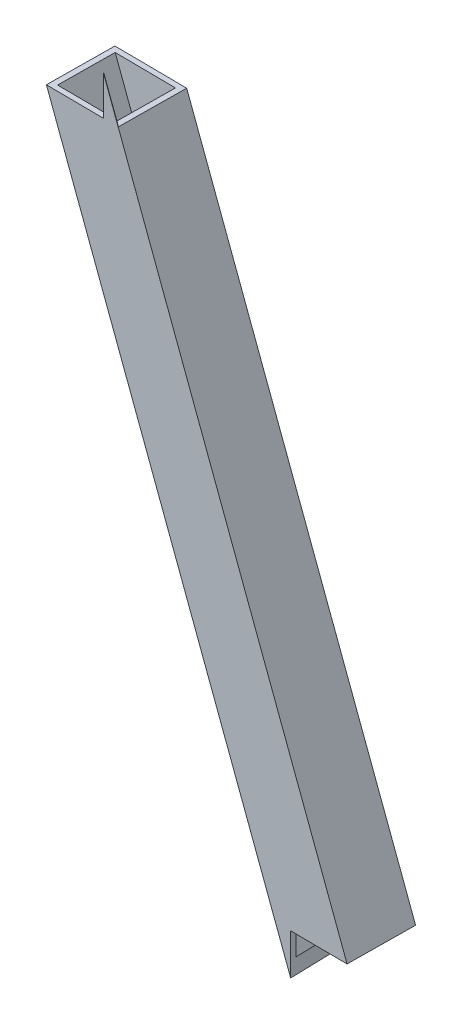
ISO-10303-21;
HEADER;
FILE_DESCRIPTION(('STEP AP214'),'2;1');
FILE_NAME('part.step','',(''),(''),'','','');
FILE_SCHEMA(('AUTOMOTIVE_DESIGN { 1 0 10303 214 1 1 1 1 }'));
ENDSEC;
DATA;
#1=APPLICATION_CONTEXT('core data for automotive mechanical design processes');
#2=APPLICATION_PROTOCOL_DEFINITION('international standard','automotive_design',2000,#1);
#3=PRODUCT_CONTEXT('',#1,'mechanical');
#4=PRODUCT('Part','Part','',(#3));
#5=PRODUCT_RELATED_PRODUCT_CATEGORY('part','',(#4));
#6=PRODUCT_DEFINITION_FORMATION('','',#4);
#7=PRODUCT_DEFINITION_CONTEXT('part definition',#1,'design');
#8=PRODUCT_DEFINITION('design','',#6,#7);
#9=PRODUCT_DEFINITION_SHAPE('','',#8);
#10=(LENGTH_UNIT() NAMED_UNIT(*) SI_UNIT(.MILLI.,.METRE.));
#11=(NAMED_UNIT(*) PLANE_ANGLE_UNIT() SI_UNIT($,.RADIAN.));
#12=(NAMED_UNIT(*) SI_UNIT($,.STERADIAN.) SOLID_ANGLE_UNIT());
#13=UNCERTAINTY_MEASURE_WITH_UNIT(LENGTH_MEASURE(1.E-05),#10,'distance_accuracy_value','');
#14=(GEOMETRIC_REPRESENTATION_CONTEXT(3) GLOBAL_UNCERTAINTY_ASSIGNED_CONTEXT((#13)) GLOBAL_UNIT_ASSIGNED_CONTEXT((#10,
#11,#12)) REPRESENTATION_CONTEXT('',''));
#15=CARTESIAN_POINT('',(0.,0.,0.));
#16=DIRECTION('',(0.,0.,1.));
#17=DIRECTION('',(1.,0.,0.));
#18=AXIS2_PLACEMENT_3D('',#15,#16,#17);
#19=CARTESIAN_POINT('',(-215.72801678848,203.47699370432,-189.903424238614));
#20=DIRECTION('',(0.00908676337012188,0.0034075362637957,-0.999952908605234));
#21=DIRECTION('',(-0.999958714034088,0.,-0.00908681612516445));
#22=AXIS2_PLACEMENT_3D('',#19,#20,#21);
#23=PLANE('',#22);
#24=DIRECTION('',(0.,-0.999994193852042,-0.00340767695139654));
#25=VECTOR('',#24,1.);
#26=CARTESIAN_POINT('',(-159.999999999999,203.475268028738,-189.397018969942));
#27=LINE('',#26,#25);
#28=CARTESIAN_POINT('',(-159.999999999999,10.,-190.056324009492));
#29=VERTEX_POINT('',#28);
#30=CARTESIAN_POINT('',(-159.999999999999,-2.08839370672417,-190.097517589282));
#31=VERTEX_POINT('',#30);
#32=EDGE_CURVE('E81',#29,#31,#27,.T.);
#33=ORIENTED_EDGE('',*,*,#32,.F.);
#34=DIRECTION('',(-0.999958714034088,0.,-0.00908681612516445));
#35=VECTOR('',#34,1.);
#36=CARTESIAN_POINT('',(-215.722025998725,10.,-190.56268071929));
#37=LINE('',#36,#35);
#38=CARTESIAN_POINT('',(-143.17414414936,10.,-189.903424238614));
#39=VERTEX_POINT('',#38);
#40=EDGE_CURVE('E215',#39,#29,#37,.T.);
#41=ORIENTED_EDGE('',*,*,#40,.F.);
#42=DIRECTION('',(0.351123441588392,-0.936329177569044,0.));
#43=VECTOR('',#42,1.);
#44=CARTESIAN_POINT('',(-215.72801678848,203.47699370432,-189.903424238614));
#45=LINE('',#44,#43);
#46=CARTESIAN_POINT('',(-215.,201.535615601707,-189.903424238614));
#47=VERTEX_POINT('',#46);
#48=EDGE_CURVE('E149',#47,#39,#45,.T.);
#49=ORIENTED_EDGE('',*,*,#48,.F.);
#50=DIRECTION('',(0.,0.999994193852042,0.00340767695139654));
#51=VECTOR('',#50,1.);
#52=CARTESIAN_POINT('',(-215.,203.476971160528,-189.896808687611));
#53=LINE('',#52,#51);
#54=CARTESIAN_POINT('',(-215.,190.,-189.942734118259));
#55=VERTEX_POINT('',#54);
#56=EDGE_CURVE('E95',#55,#47,#53,.T.);
#57=ORIENTED_EDGE('',*,*,#56,.F.);
#58=DIRECTION('',(0.999958714034088,0.,0.00908681612516445));
#59=VECTOR('',#58,1.);
#60=CARTESIAN_POINT('',(-215.727599489067,190.,-189.949345954005));
#61=LINE('',#60,#59);
#62=CARTESIAN_POINT('',(-232.033147640021,190.,-190.097517589282));
#63=VERTEX_POINT('',#62);
#64=EDGE_CURVE('E156',#63,#55,#61,.T.);
#65=ORIENTED_EDGE('',*,*,#64,.F.);
#66=DIRECTION('',(0.351123441588392,-0.936329177569044,0.));
#67=VECTOR('',#66,1.);
#68=CARTESIAN_POINT('',(-234.453718478922,196.454855570404,-190.097517589282));
#69=LINE('',#68,#67);
#70=EDGE_CURVE('E45',#63,#31,#69,.T.);
#71=ORIENTED_EDGE('',*,*,#70,.T.);
#72=EDGE_LOOP('',(#33,#41,#49,#57,#65,#71));
#73=FACE_BOUND('',#72,.T.);
#74=ADVANCED_FACE('F41',(#73),#23,.F.);
#75=CARTESIAN_POINT('',(-217.211534102323,202.920674711628,-191.518876360436));
#76=DIRECTION('',(0.00908676337012202,0.00340753626379576,-0.999952908605234));
#77=DIRECTION('',(-0.999958714034088,0.,-0.00908681612516459));
#78=AXIS2_PLACEMENT_3D('',#75,#76,#77);
#79=PLANE('',#78);
#80=DIRECTION('',(-0.999958714034088,0.,-0.00908681612516459));
#81=VECTOR('',#80,1.);
#82=CARTESIAN_POINT('',(-217.205560538338,10.,-192.176237231229));
#83=LINE('',#82,#81);
#84=CARTESIAN_POINT('',(-144.866281085462,10.,-191.518876360436));
#85=VERTEX_POINT('',#84);
#86=CARTESIAN_POINT('',(-160.000000000002,10.,-191.656399359272));
#87=VERTEX_POINT('',#86);
#88=EDGE_CURVE('E226',#85,#87,#83,.T.);
#89=ORIENTED_EDGE('',*,*,#88,.T.);
#90=DIRECTION('',(0.,-0.999994193852042,-0.00340767695139659));
#91=VECTOR('',#90,1.);
#92=CARTESIAN_POINT('',(-159.999999999999,202.918903097401,-190.998990242683));
#93=LINE('',#92,#91);
#94=CARTESIAN_POINT('',(-159.999999999999,2.51241595302107,-191.681914774997));
#95=VERTEX_POINT('',#94);
#96=EDGE_CURVE('E188',#87,#95,#93,.T.);
#97=ORIENTED_EDGE('',*,*,#96,.T.);
#98=DIRECTION('',(0.351123441588392,-0.936329177569044,0.));
#99=VECTOR('',#98,1.);
#100=CARTESIAN_POINT('',(-232.941123522295,197.022078679139,-191.681914774997));
#101=LINE('',#100,#99);
#102=CARTESIAN_POINT('',(-230.307844017617,190.,-191.681914774997));
#103=VERTEX_POINT('',#102);
#104=EDGE_CURVE('E169',#103,#95,#101,.T.);
#105=ORIENTED_EDGE('',*,*,#104,.F.);
#106=DIRECTION('',(0.999958714034088,0.,0.00908681612516459));
#107=VECTOR('',#106,1.);
#108=CARTESIAN_POINT('',(-217.21113402868,190.,-191.562902465944));
#109=LINE('',#108,#107);
#110=CARTESIAN_POINT('',(-212.366281085463,190.,-191.518876360436));
#111=VERTEX_POINT('',#110);
#112=EDGE_CURVE('E182',#103,#111,#109,.T.);
#113=ORIENTED_EDGE('',*,*,#112,.T.);
#114=DIRECTION('',(0.351123441588392,-0.936329177569044,0.));
#115=VECTOR('',#114,1.);
#116=CARTESIAN_POINT('',(-217.211534102323,202.920674711628,-191.518876360436));
#117=LINE('',#116,#115);
#118=EDGE_CURVE('E175',#111,#85,#117,.T.);
#119=ORIENTED_EDGE('',*,*,#118,.T.);
#120=EDGE_LOOP('',(#89,#97,#105,#113,#119));
#121=FACE_BOUND('',#120,.T.);
#122=ADVANCED_FACE('F262',(#121),#79,.T.);
#123=CARTESIAN_POINT('',(-217.058876477705,202.97792132086,-208.318085225003));
#124=DIRECTION('',(-0.00908676337012202,-0.00340753626379576,0.999952908605234));
#125=DIRECTION('',(0.999958714034088,0.,0.00908681612516459));
#126=AXIS2_PLACEMENT_3D('',#123,#124,#125);
#127=PLANE('',#126);
#128=DIRECTION('',(0.351123441588392,-0.936329177569044,0.));
#129=VECTOR('',#128,1.);
#130=CARTESIAN_POINT('',(-232.788465897676,197.079325288371,-208.481123639564));
#131=LINE('',#130,#129);
#132=CARTESIAN_POINT('',(-230.133718914537,190.,-208.481123639564));
#133=VERTEX_POINT('',#132);
#134=CARTESIAN_POINT('',(-159.999999999999,2.97674956123141,-208.481123639564));
#135=VERTEX_POINT('',#134);
#136=EDGE_CURVE('E172',#133,#135,#131,.T.);
#137=ORIENTED_EDGE('',*,*,#136,.T.);
#138=DIRECTION('',(0.,0.999994193852042,0.00340767695139659));
#139=VECTOR('',#138,1.);
#140=CARTESIAN_POINT('',(-159.999999999999,202.976154433834,-207.799586320181));
#141=LINE('',#140,#139);
#142=CARTESIAN_POINT('',(-159.999999999999,10.,-208.457190531961));
#143=VERTEX_POINT('',#142);
#144=EDGE_CURVE('E174',#135,#143,#141,.T.);
#145=ORIENTED_EDGE('',*,*,#144,.T.);
#146=DIRECTION('',(0.999958714034088,0.,0.00908681612516459));
#147=VECTOR('',#146,1.);
#148=CARTESIAN_POINT('',(-217.052901141145,10.,-208.975641158773));
#149=LINE('',#148,#147);
#150=CARTESIAN_POINT('',(-144.692155982383,10.,-208.318085225003));
#151=VERTEX_POINT('',#150);
#152=EDGE_CURVE('E180',#143,#151,#149,.T.);
#153=ORIENTED_EDGE('',*,*,#152,.T.);
#154=DIRECTION('',(0.351123441588392,-0.936329177569044,0.));
#155=VECTOR('',#154,1.);
#156=CARTESIAN_POINT('',(-217.058876477705,202.97792132086,-208.318085225003));
#157=LINE('',#156,#155);
#158=CARTESIAN_POINT('',(-212.192155982383,190.,-208.318085225003));
#159=VERTEX_POINT('',#158);
#160=EDGE_CURVE('E192',#159,#151,#157,.T.);
#161=ORIENTED_EDGE('',*,*,#160,.F.);
#162=DIRECTION('',(-0.999958714034088,0.,-0.00908681612516459));
#163=VECTOR('',#162,1.);
#164=CARTESIAN_POINT('',(-217.058474631488,190.,-208.362306393488));
#165=LINE('',#164,#163);
#166=EDGE_CURVE('E210',#159,#133,#165,.T.);
#167=ORIENTED_EDGE('',*,*,#166,.T.);
#168=EDGE_LOOP('',(#137,#145,#153,#161,#167));
#169=FACE_BOUND('',#168,.T.);
#170=ADVANCED_FACE('F267',(#169),#127,.T.);
#171=CARTESIAN_POINT('',(-215.546281521078,203.545144429596,-209.902482410718));
#172=DIRECTION('',(-0.0090867633701231,-0.00340753626379616,0.999952908605233));
#173=DIRECTION('',(0.999958714034088,0.,0.00908681612516567));
#174=AXIS2_PLACEMENT_3D('',#171,#172,#173);
#175=PLANE('',#174);
#176=DIRECTION('',(0.,0.999994193852042,0.003407676951397));
#177=VECTOR('',#176,1.);
#178=CARTESIAN_POINT('',(-159.999999999999,203.543424381634,-209.39772858601));
#179=LINE('',#178,#177);
#180=CARTESIAN_POINT('',(-159.999999999999,-1.53561560170892,-210.096575761386));
#181=VERTEX_POINT('',#180);
#182=CARTESIAN_POINT('',(-159.999999999999,10.,-210.057265881741));
#183=VERTEX_POINT('',#182);
#184=EDGE_CURVE('E11',#181,#183,#179,.T.);
#185=ORIENTED_EDGE('',*,*,#184,.F.);
#186=DIRECTION('',(0.351123441588392,-0.936329177569044,0.));
#187=VECTOR('',#186,1.);
#188=CARTESIAN_POINT('',(-234.27198321152,196.52300629568,-210.096575761386));
#189=LINE('',#188,#187);
#190=CARTESIAN_POINT('',(-231.82585585064,190.,-210.096575761386));
#191=VERTEX_POINT('',#190);
#192=EDGE_CURVE('E154',#191,#181,#189,.T.);
#193=ORIENTED_EDGE('',*,*,#192,.F.);
#194=DIRECTION('',(-0.999958714034088,0.,-0.00908681612516567));
#195=VECTOR('',#194,1.);
#196=CARTESIAN_POINT('',(-215.545862111457,190.,-209.948636343938));
#197=LINE('',#196,#195);
#198=CARTESIAN_POINT('',(-210.466852359978,190.,-209.902482410718));
#199=VERTEX_POINT('',#198);
#200=EDGE_CURVE('E137',#199,#191,#197,.T.);
#201=ORIENTED_EDGE('',*,*,#200,.F.);
#202=DIRECTION('',(0.351123441588392,-0.936329177569044,0.));
#203=VECTOR('',#202,1.);
#204=CARTESIAN_POINT('',(-215.546281521078,203.545144429596,-209.902482410718));
#205=LINE('',#204,#203);
#206=CARTESIAN_POINT('',(-142.966852359979,10.,-209.902482410718));
#207=VERTEX_POINT('',#206);
#208=EDGE_CURVE('E171',#199,#207,#205,.T.);
#209=ORIENTED_EDGE('',*,*,#208,.T.);
#210=DIRECTION('',(0.999958714034088,0.,0.00908681612516567));
#211=VECTOR('',#210,1.);
#212=CARTESIAN_POINT('',(-215.540288621115,10.,-210.561971109223));
#213=LINE('',#212,#211);
#214=EDGE_CURVE('E218',#183,#207,#213,.T.);
#215=ORIENTED_EDGE('',*,*,#214,.F.);
#216=EDGE_LOOP('',(#185,#193,#201,#209,#215));
#217=FACE_BOUND('',#216,.T.);
#218=ADVANCED_FACE('F158',(#217),#175,.F.);
#219=CARTESIAN_POINT('',(-232.941123522295,197.022078679139,-191.681914774997));
#220=DIRECTION('',(0.936285084522112,0.351106906695792,0.00970466753340175));
#221=DIRECTION('',(-0.351123441588392,0.936329177569045,0.));
#222=AXIS2_PLACEMENT_3D('',#219,#220,#221);
#223=PLANE('',#222);
#224=ORIENTED_EDGE('',*,*,#104,.T.);
#225=DIRECTION('',(0.,0.0276296546156806,-0.999618228218062));
#226=VECTOR('',#225,1.);
#227=CARTESIAN_POINT('',(-159.999999999999,2.66090420438006,-197.054097844335));
#228=LINE('',#227,#226);
#229=EDGE_CURVE('E164',#95,#135,#228,.T.);
#230=ORIENTED_EDGE('',*,*,#229,.T.);
#231=ORIENTED_EDGE('',*,*,#136,.F.);
#232=DIRECTION('',(-0.0103645208346853,0.,0.999946286911386));
#233=VECTOR('',#232,1.);
#234=CARTESIAN_POINT('',(-230.308126893171,190.,-191.654623560681));
#235=LINE('',#234,#233);
#236=EDGE_CURVE('E160',#133,#103,#235,.T.);
#237=ORIENTED_EDGE('',*,*,#236,.T.);
#238=EDGE_LOOP('',(#224,#230,#231,#237));
#239=FACE_BOUND('',#238,.T.);
#240=ADVANCED_FACE('F257',(#239),#223,.T.);
#241=CARTESIAN_POINT('',(-234.453718478922,196.454855570404,-190.097517589282));
#242=DIRECTION('',(0.936285084522112,0.351106906695792,0.00970466753338271));
#243=DIRECTION('',(-0.351123441588392,0.936329177569045,0.));
#244=AXIS2_PLACEMENT_3D('',#241,#242,#243);
#245=PLANE('',#244);
#246=DIRECTION('',(0.,0.0276296546156264,-0.999618228218064));
#247=VECTOR('',#246,1.);
#248=CARTESIAN_POINT('',(-159.999999999999,-1.93682622420605,-195.581104714708));
#249=LINE('',#248,#247);
#250=EDGE_CURVE('E51',#31,#181,#249,.T.);
#251=ORIENTED_EDGE('',*,*,#250,.F.);
#252=ORIENTED_EDGE('',*,*,#70,.F.);
#253=DIRECTION('',(-0.010364520834665,0.,0.999946286911386));
#254=VECTOR('',#253,1.);
#255=CARTESIAN_POINT('',(-232.033407665709,190.,-190.072430879947));
#256=LINE('',#255,#254);
#257=EDGE_CURVE('E141',#191,#63,#256,.T.);
#258=ORIENTED_EDGE('',*,*,#257,.F.);
#259=ORIENTED_EDGE('',*,*,#192,.T.);
#260=EDGE_LOOP('',(#251,#252,#258,#259));
#261=FACE_BOUND('',#260,.T.);
#262=ADVANCED_FACE('F153',(#261),#245,.F.);
#263=CARTESIAN_POINT('',(-215.72801678848,203.47699370432,-189.903424238614));
#264=DIRECTION('',(-0.936285084522112,-0.351106906695792,-0.00970466753338269));
#265=DIRECTION('',(0.351123441588392,-0.936329177569045,0.));
#266=AXIS2_PLACEMENT_3D('',#263,#264,#265);
#267=PLANE('',#266);
#268=DIRECTION('',(0.,0.0276296546156255,-0.999618228218064));
#269=VECTOR('',#268,1.);
#270=CARTESIAN_POINT('',(-215.,201.537097645507,-189.957043366979));
#271=LINE('',#270,#269);
#272=CARTESIAN_POINT('',(-215.,201.53828497573,-190.));
#273=VERTEX_POINT('',#272);
#274=EDGE_CURVE('E89',#47,#273,#271,.T.);
#275=ORIENTED_EDGE('',*,*,#274,.F.);
#276=ORIENTED_EDGE('',*,*,#48,.T.);
#277=DIRECTION('',(-0.010364520834665,0.,0.999946286911386));
#278=VECTOR('',#277,1.);
#279=CARTESIAN_POINT('',(-143.181938125216,10.,-189.151478505507));
#280=LINE('',#279,#278);
#281=EDGE_CURVE('E204',#207,#39,#280,.T.);
#282=ORIENTED_EDGE('',*,*,#281,.F.);
#283=ORIENTED_EDGE('',*,*,#208,.F.);
#284=DIRECTION('',(0.010364520834665,0.,-0.999946286911386));
#285=VECTOR('',#284,1.);
#286=CARTESIAN_POINT('',(-210.674687052997,190.,-189.851046083893));
#287=LINE('',#286,#285);
#288=CARTESIAN_POINT('',(-210.673143134101,190.,-190.));
#289=VERTEX_POINT('',#288);
#290=EDGE_CURVE('E145',#289,#199,#287,.T.);
#291=ORIENTED_EDGE('',*,*,#290,.F.);
#292=DIRECTION('',(0.351123441588392,-0.936329177569045,0.));
#293=VECTOR('',#292,1.);
#294=CARTESIAN_POINT('',(-215.727139186061,203.477322805227,-190.));
#295=LINE('',#294,#293);
#296=EDGE_CURVE('E199',#273,#289,#295,.T.);
#297=ORIENTED_EDGE('',*,*,#296,.F.);
#298=EDGE_LOOP('',(#275,#276,#282,#283,#291,#297));
#299=FACE_BOUND('',#298,.T.);
#300=ADVANCED_FACE('F247',(#299),#267,.F.);
#301=CARTESIAN_POINT('',(-235.,190.,-450.));
#302=DIRECTION('',(0.,1.,0.));
#303=DIRECTION('',(0.,0.,1.));
#304=AXIS2_PLACEMENT_3D('',#301,#302,#303);
#305=PLANE('',#304);
#306=ORIENTED_EDGE('',*,*,#236,.F.);
#307=ORIENTED_EDGE('',*,*,#166,.F.);
#308=DIRECTION('',(0.0103645208346853,0.,-0.999946286911386));
#309=VECTOR('',#308,1.);
#310=CARTESIAN_POINT('',(-212.366801578493,190.,-191.468660331996));
#311=LINE('',#310,#309);
#312=EDGE_CURVE('E195',#111,#159,#311,.T.);
#313=ORIENTED_EDGE('',*,*,#312,.F.);
#314=ORIENTED_EDGE('',*,*,#112,.F.);
#315=EDGE_LOOP('',(#306,#307,#313,#314));
#316=FACE_BOUND('',#315,.T.);
#317=ORIENTED_EDGE('',*,*,#200,.T.);
#318=ORIENTED_EDGE('',*,*,#257,.T.);
#319=ORIENTED_EDGE('',*,*,#64,.T.);
#320=DIRECTION('',(0.,0.,1.));
#321=VECTOR('',#320,1.);
#322=CARTESIAN_POINT('',(-215.,190.,-450.));
#323=LINE('',#322,#321);
#324=CARTESIAN_POINT('',(-215.,190.,-190.));
#325=VERTEX_POINT('',#324);
#326=EDGE_CURVE('E201',#325,#55,#323,.T.);
#327=ORIENTED_EDGE('',*,*,#326,.F.);
#328=DIRECTION('',(1.,0.,0.));
#329=VECTOR('',#328,1.);
#330=CARTESIAN_POINT('',(-225.,190.,-190.));
#331=LINE('',#330,#329);
#332=EDGE_CURVE('E205',#325,#289,#331,.T.);
#333=ORIENTED_EDGE('',*,*,#332,.T.);
#334=ORIENTED_EDGE('',*,*,#290,.T.);
#335=EDGE_LOOP('',(#317,#318,#319,#327,#333,#334));
#336=FACE_BOUND('',#335,.T.);
#337=ADVANCED_FACE('F139',(#316,#336),#305,.T.);
#338=CARTESIAN_POINT('',(-225.,190.,-190.));
#339=DIRECTION('',(0.,0.,-1.));
#340=DIRECTION('',(-1.,0.,0.));
#341=AXIS2_PLACEMENT_3D('',#338,#339,#340);
#342=PLANE('',#341);
#343=ORIENTED_EDGE('',*,*,#332,.F.);
#344=DIRECTION('',(0.,1.,0.));
#345=VECTOR('',#344,1.);
#346=CARTESIAN_POINT('',(-215.,190.,-190.));
#347=LINE('',#346,#345);
#348=EDGE_CURVE('E196',#325,#273,#347,.T.);
#349=ORIENTED_EDGE('',*,*,#348,.T.);
#350=ORIENTED_EDGE('',*,*,#296,.T.);
#351=EDGE_LOOP('',(#343,#349,#350));
#352=FACE_BOUND('',#351,.T.);
#353=ADVANCED_FACE('F244',(#352),#342,.T.);
#354=CARTESIAN_POINT('',(-217.211534102323,202.920674711628,-191.518876360436));
#355=DIRECTION('',(-0.936285084522112,-0.351106906695792,-0.00970466753340175));
#356=DIRECTION('',(0.351123441588392,-0.936329177569045,0.));
#357=AXIS2_PLACEMENT_3D('',#354,#355,#356);
#358=PLANE('',#357);
#359=ORIENTED_EDGE('',*,*,#118,.F.);
#360=ORIENTED_EDGE('',*,*,#312,.T.);
#361=ORIENTED_EDGE('',*,*,#160,.T.);
#362=DIRECTION('',(-0.0103645208346853,0.,0.999946286911386));
#363=VECTOR('',#362,1.);
#364=CARTESIAN_POINT('',(-144.874052650712,10.,-190.769092753608));
#365=LINE('',#364,#363);
#366=EDGE_CURVE('E194',#151,#85,#365,.T.);
#367=ORIENTED_EDGE('',*,*,#366,.T.);
#368=EDGE_LOOP('',(#359,#360,#361,#367));
#369=FACE_BOUND('',#368,.T.);
#370=ADVANCED_FACE('F279',(#369),#358,.T.);
#371=CARTESIAN_POINT('',(-139.999999999999,10.,-200.));
#372=DIRECTION('',(0.,-1.,0.));
#373=DIRECTION('',(0.,0.,-1.));
#374=AXIS2_PLACEMENT_3D('',#371,#372,#373);
#375=PLANE('',#374);
#376=ORIENTED_EDGE('',*,*,#40,.T.);
#377=DIRECTION('',(0.,0.,-1.));
#378=VECTOR('',#377,1.);
#379=CARTESIAN_POINT('',(-159.999999999999,10.,-200.));
#380=LINE('',#379,#378);
#381=EDGE_CURVE('E60',#29,#87,#380,.T.);
#382=ORIENTED_EDGE('',*,*,#381,.T.);
#383=ORIENTED_EDGE('',*,*,#88,.F.);
#384=ORIENTED_EDGE('',*,*,#366,.F.);
#385=ORIENTED_EDGE('',*,*,#152,.F.);
#386=DIRECTION('',(0.,0.,-1.));
#387=VECTOR('',#386,1.);
#388=CARTESIAN_POINT('',(-159.999999999999,10.,-200.));
#389=LINE('',#388,#387);
#390=EDGE_CURVE('E221',#143,#183,#389,.T.);
#391=ORIENTED_EDGE('',*,*,#390,.T.);
#392=ORIENTED_EDGE('',*,*,#214,.T.);
#393=ORIENTED_EDGE('',*,*,#281,.T.);
#394=EDGE_LOOP('',(#376,#382,#383,#384,#385,#391,#392,#393));
#395=FACE_BOUND('',#394,.T.);
#396=ADVANCED_FACE('F235',(#395),#375,.T.);
#397=CARTESIAN_POINT('',(-215.,190.,-450.));
#398=DIRECTION('',(-1.,0.,0.));
#399=DIRECTION('',(0.,0.,1.));
#400=AXIS2_PLACEMENT_3D('',#397,#398,#399);
#401=PLANE('',#400);
#402=ORIENTED_EDGE('',*,*,#348,.F.);
#403=ORIENTED_EDGE('',*,*,#326,.T.);
#404=ORIENTED_EDGE('',*,*,#56,.T.);
#405=ORIENTED_EDGE('',*,*,#274,.T.);
#406=EDGE_LOOP('',(#402,#403,#404,#405));
#407=FACE_BOUND('',#406,.T.);
#408=ADVANCED_FACE('F242',(#407),#401,.T.);
#409=CARTESIAN_POINT('',(-159.999999999999,-10.,-200.));
#410=DIRECTION('',(1.,0.,0.));
#411=DIRECTION('',(0.,0.,-1.));
#412=AXIS2_PLACEMENT_3D('',#409,#410,#411);
#413=PLANE('',#412);
#414=ORIENTED_EDGE('',*,*,#32,.T.);
#415=ORIENTED_EDGE('',*,*,#250,.T.);
#416=ORIENTED_EDGE('',*,*,#184,.T.);
#417=ORIENTED_EDGE('',*,*,#390,.F.);
#418=ORIENTED_EDGE('',*,*,#144,.F.);
#419=ORIENTED_EDGE('',*,*,#229,.F.);
#420=ORIENTED_EDGE('',*,*,#96,.F.);
#421=ORIENTED_EDGE('',*,*,#381,.F.);
#422=EDGE_LOOP('',(#414,#415,#416,#417,#418,#419,#420,#421));
#423=FACE_BOUND('',#422,.T.);
#424=ADVANCED_FACE('F43',(#423),#413,.T.);
#425=CLOSED_SHELL('',(#74,#122,#170,#218,#240,#262,#300,#337,#353,#370,#396,#408,#424));
#426=MANIFOLD_SOLID_BREP('B2',#425);
#427=ADVANCED_BREP_SHAPE_REPRESENTATION('',(#18,#426),#14);
#428=SHAPE_DEFINITION_REPRESENTATION(#9,#427);
ENDSEC;
END-ISO-10303-21;
